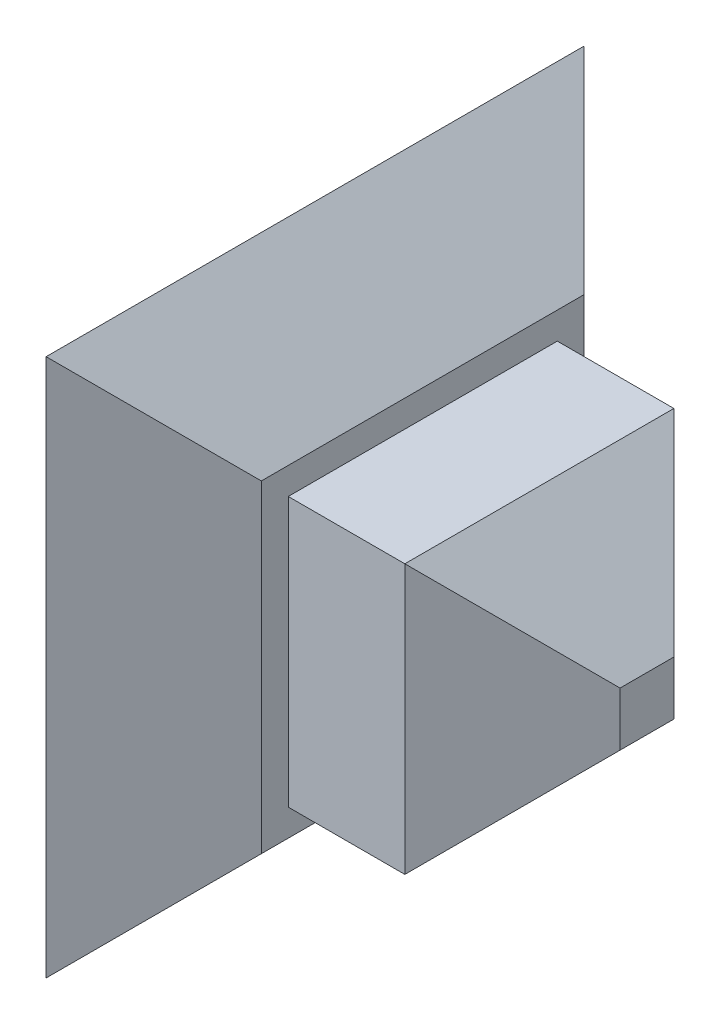
ISO-10303-21;
HEADER;
FILE_DESCRIPTION(('STEP AP214'),'2;1');
FILE_NAME('part.step','',(''),(''),'','','');
FILE_SCHEMA(('AUTOMOTIVE_DESIGN { 1 0 10303 214 1 1 1 1 }'));
ENDSEC;
DATA;
#1=APPLICATION_CONTEXT('core data for automotive mechanical design processes');
#2=APPLICATION_PROTOCOL_DEFINITION('international standard','automotive_design',2000,#1);
#3=PRODUCT_CONTEXT('',#1,'mechanical');
#4=PRODUCT('Part','Part','',(#3));
#5=PRODUCT_RELATED_PRODUCT_CATEGORY('part','',(#4));
#6=PRODUCT_DEFINITION_FORMATION('','',#4);
#7=PRODUCT_DEFINITION_CONTEXT('part definition',#1,'design');
#8=PRODUCT_DEFINITION('design','',#6,#7);
#9=PRODUCT_DEFINITION_SHAPE('','',#8);
#10=(LENGTH_UNIT() NAMED_UNIT(*) SI_UNIT(.MILLI.,.METRE.));
#11=(NAMED_UNIT(*) PLANE_ANGLE_UNIT() SI_UNIT($,.RADIAN.));
#12=(NAMED_UNIT(*) SI_UNIT($,.STERADIAN.) SOLID_ANGLE_UNIT());
#13=UNCERTAINTY_MEASURE_WITH_UNIT(LENGTH_MEASURE(1.E-05),#10,'distance_accuracy_value','');
#14=(GEOMETRIC_REPRESENTATION_CONTEXT(3) GLOBAL_UNCERTAINTY_ASSIGNED_CONTEXT((#13)) GLOBAL_UNIT_ASSIGNED_CONTEXT((#10,
#11,#12)) REPRESENTATION_CONTEXT('',''));
#15=CARTESIAN_POINT('',(0.,0.,0.));
#16=DIRECTION('',(0.,0.,1.));
#17=DIRECTION('',(1.,0.,0.));
#18=AXIS2_PLACEMENT_3D('',#15,#16,#17);
#19=CARTESIAN_POINT('',(-19.05,19.05,19.05));
#20=DIRECTION('',(0.,0.,1.));
#21=DIRECTION('',(0.,-1.,0.));
#22=AXIS2_PLACEMENT_3D('',#19,#20,#21);
#23=PLANE('',#22);
#24=DIRECTION('',(1.,0.,0.));
#25=VECTOR('',#24,1.);
#26=CARTESIAN_POINT('',(-19.05,19.05,19.05));
#27=LINE('',#26,#25);
#28=CARTESIAN_POINT('',(-16.51,19.05,19.05));
#29=VERTEX_POINT('',#28);
#30=CARTESIAN_POINT('',(0.,19.05,19.05));
#31=VERTEX_POINT('',#30);
#32=EDGE_CURVE('E55',#29,#31,#27,.T.);
#33=ORIENTED_EDGE('',*,*,#32,.F.);
#34=DIRECTION('',(0.,-1.,0.));
#35=VECTOR('',#34,1.);
#36=CARTESIAN_POINT('',(-16.51,19.05,19.05));
#37=LINE('',#36,#35);
#38=CARTESIAN_POINT('',(-16.51,-19.05,19.05));
#39=VERTEX_POINT('',#38);
#40=EDGE_CURVE('E184',#29,#39,#37,.T.);
#41=ORIENTED_EDGE('',*,*,#40,.T.);
#42=DIRECTION('',(1.,0.,0.));
#43=VECTOR('',#42,1.);
#44=CARTESIAN_POINT('',(-19.05,-19.05,19.05));
#45=LINE('',#44,#43);
#46=CARTESIAN_POINT('',(0.,-19.05,19.05));
#47=VERTEX_POINT('',#46);
#48=EDGE_CURVE('E233',#39,#47,#45,.T.);
#49=ORIENTED_EDGE('',*,*,#48,.T.);
#50=DIRECTION('',(0.,-1.,0.));
#51=VECTOR('',#50,1.);
#52=CARTESIAN_POINT('',(0.,19.05,19.05));
#53=LINE('',#52,#51);
#54=EDGE_CURVE('E193',#31,#47,#53,.T.);
#55=ORIENTED_EDGE('',*,*,#54,.F.);
#56=EDGE_LOOP('',(#33,#41,#49,#55));
#57=FACE_BOUND('',#56,.T.);
#58=ADVANCED_FACE('F47',(#57),#23,.T.);
#59=CARTESIAN_POINT('',(-19.05,19.05,-19.05));
#60=DIRECTION('',(0.,1.,0.));
#61=DIRECTION('',(0.,0.,1.));
#62=AXIS2_PLACEMENT_3D('',#59,#60,#61);
#63=PLANE('',#62);
#64=DIRECTION('',(1.,0.,0.));
#65=VECTOR('',#64,1.);
#66=CARTESIAN_POINT('',(-19.05,19.05,-19.05));
#67=LINE('',#66,#65);
#68=CARTESIAN_POINT('',(-16.51,19.05,-19.05));
#69=VERTEX_POINT('',#68);
#70=CARTESIAN_POINT('',(0.,19.05,-19.05));
#71=VERTEX_POINT('',#70);
#72=EDGE_CURVE('E68',#69,#71,#67,.T.);
#73=ORIENTED_EDGE('',*,*,#72,.F.);
#74=DIRECTION('',(0.,0.,1.));
#75=VECTOR('',#74,1.);
#76=CARTESIAN_POINT('',(-16.51,19.05,-19.05));
#77=LINE('',#76,#75);
#78=EDGE_CURVE('E180',#69,#29,#77,.T.);
#79=ORIENTED_EDGE('',*,*,#78,.T.);
#80=ORIENTED_EDGE('',*,*,#32,.T.);
#81=DIRECTION('',(0.,0.,1.));
#82=VECTOR('',#81,1.);
#83=CARTESIAN_POINT('',(0.,19.05,-19.05));
#84=LINE('',#83,#82);
#85=EDGE_CURVE('E229',#71,#31,#84,.T.);
#86=ORIENTED_EDGE('',*,*,#85,.F.);
#87=EDGE_LOOP('',(#73,#79,#80,#86));
#88=FACE_BOUND('',#87,.T.);
#89=ADVANCED_FACE('F262',(#88),#63,.T.);
#90=CARTESIAN_POINT('',(-19.05,19.05,-19.05));
#91=DIRECTION('',(0.,0.,-1.));
#92=DIRECTION('',(0.,1.,0.));
#93=AXIS2_PLACEMENT_3D('',#90,#91,#92);
#94=PLANE('',#93);
#95=DIRECTION('',(1.,0.,0.));
#96=VECTOR('',#95,1.);
#97=CARTESIAN_POINT('',(-19.05,-19.05,-19.05));
#98=LINE('',#97,#96);
#99=CARTESIAN_POINT('',(-16.51,-19.05,-19.05));
#100=VERTEX_POINT('',#99);
#101=CARTESIAN_POINT('',(0.,-19.05,-19.05));
#102=VERTEX_POINT('',#101);
#103=EDGE_CURVE('E238',#100,#102,#98,.T.);
#104=ORIENTED_EDGE('',*,*,#103,.F.);
#105=DIRECTION('',(0.,1.,0.));
#106=VECTOR('',#105,1.);
#107=CARTESIAN_POINT('',(-16.51,19.05,-19.05));
#108=LINE('',#107,#106);
#109=EDGE_CURVE('E62',#100,#69,#108,.T.);
#110=ORIENTED_EDGE('',*,*,#109,.T.);
#111=ORIENTED_EDGE('',*,*,#72,.T.);
#112=DIRECTION('',(0.,1.,0.));
#113=VECTOR('',#112,1.);
#114=CARTESIAN_POINT('',(0.,19.05,-19.05));
#115=LINE('',#114,#113);
#116=EDGE_CURVE('E225',#102,#71,#115,.T.);
#117=ORIENTED_EDGE('',*,*,#116,.F.);
#118=EDGE_LOOP('',(#104,#110,#111,#117));
#119=FACE_BOUND('',#118,.T.);
#120=ADVANCED_FACE('F266',(#119),#94,.T.);
#121=CARTESIAN_POINT('',(-19.05,-19.05,-19.05));
#122=DIRECTION('',(0.,-1.,0.));
#123=DIRECTION('',(0.,0.,-1.));
#124=AXIS2_PLACEMENT_3D('',#121,#122,#123);
#125=PLANE('',#124);
#126=ORIENTED_EDGE('',*,*,#48,.F.);
#127=DIRECTION('',(0.,0.,-1.));
#128=VECTOR('',#127,1.);
#129=CARTESIAN_POINT('',(-16.51,-19.05,-19.05));
#130=LINE('',#129,#128);
#131=EDGE_CURVE('E11',#39,#100,#130,.T.);
#132=ORIENTED_EDGE('',*,*,#131,.T.);
#133=ORIENTED_EDGE('',*,*,#103,.T.);
#134=DIRECTION('',(0.,0.,-1.));
#135=VECTOR('',#134,1.);
#136=CARTESIAN_POINT('',(0.,-19.05,-19.05));
#137=LINE('',#136,#135);
#138=EDGE_CURVE('E221',#47,#102,#137,.T.);
#139=ORIENTED_EDGE('',*,*,#138,.F.);
#140=EDGE_LOOP('',(#126,#132,#133,#139));
#141=FACE_BOUND('',#140,.T.);
#142=ADVANCED_FACE('F247',(#141),#125,.T.);
#143=CARTESIAN_POINT('',(0.,19.05,19.05));
#144=DIRECTION('',(0.707106781186549,0.,0.707106781186546));
#145=DIRECTION('',(0.707106781186546,0.,-0.707106781186549));
#146=AXIS2_PLACEMENT_3D('',#143,#144,#145);
#147=PLANE('',#146);
#148=ORIENTED_EDGE('',*,*,#54,.T.);
#149=DIRECTION('',(-0.577350269189624,-0.577350269189627,0.577350269189626));
#150=VECTOR('',#149,1.);
#151=CARTESIAN_POINT('',(12.7,-6.34999999999997,6.34999999999997));
#152=LINE('',#151,#150);
#153=CARTESIAN_POINT('',(15.24,-3.80999999999995,3.80999999999995));
#154=VERTEX_POINT('',#153);
#155=EDGE_CURVE('E189',#154,#47,#152,.T.);
#156=ORIENTED_EDGE('',*,*,#155,.F.);
#157=DIRECTION('',(0.,1.,0.));
#158=VECTOR('',#157,1.);
#159=CARTESIAN_POINT('',(15.24,0.,3.80999999999995));
#160=LINE('',#159,#158);
#161=CARTESIAN_POINT('',(15.24,3.80999999999995,3.80999999999995));
#162=VERTEX_POINT('',#161);
#163=EDGE_CURVE('E188',#162,#154,#160,.F.);
#164=ORIENTED_EDGE('',*,*,#163,.F.);
#165=DIRECTION('',(-0.577350269189624,0.577350269189626,0.577350269189627));
#166=VECTOR('',#165,1.);
#167=CARTESIAN_POINT('',(0.,19.05,19.05));
#168=LINE('',#167,#166);
#169=EDGE_CURVE('E195',#162,#31,#168,.T.);
#170=ORIENTED_EDGE('',*,*,#169,.T.);
#171=EDGE_LOOP('',(#148,#156,#164,#170));
#172=FACE_BOUND('',#171,.T.);
#173=ADVANCED_FACE('F255',(#172),#147,.T.);
#174=CARTESIAN_POINT('',(0.,-19.05,-19.05));
#175=DIRECTION('',(0.707106781186549,-0.707106781186546,0.));
#176=DIRECTION('',(0.707106781186546,0.707106781186549,0.));
#177=AXIS2_PLACEMENT_3D('',#174,#175,#176);
#178=PLANE('',#177);
#179=ORIENTED_EDGE('',*,*,#138,.T.);
#180=DIRECTION('',(-0.577350269189624,-0.577350269189626,-0.577350269189627));
#181=VECTOR('',#180,1.);
#182=CARTESIAN_POINT('',(12.7,-6.34999999999997,-6.34999999999997));
#183=LINE('',#182,#181);
#184=CARTESIAN_POINT('',(15.24,-3.80999999999995,-3.80999999999995));
#185=VERTEX_POINT('',#184);
#186=EDGE_CURVE('E194',#185,#102,#183,.T.);
#187=ORIENTED_EDGE('',*,*,#186,.F.);
#188=DIRECTION('',(0.,0.,1.));
#189=VECTOR('',#188,1.);
#190=CARTESIAN_POINT('',(15.24,-3.80999999999995,0.));
#191=LINE('',#190,#189);
#192=EDGE_CURVE('E210',#154,#185,#191,.F.);
#193=ORIENTED_EDGE('',*,*,#192,.F.);
#194=ORIENTED_EDGE('',*,*,#155,.T.);
#195=EDGE_LOOP('',(#179,#187,#193,#194));
#196=FACE_BOUND('',#195,.T.);
#197=ADVANCED_FACE('F252',(#196),#178,.T.);
#198=CARTESIAN_POINT('',(0.,19.05,-19.05));
#199=DIRECTION('',(0.707106781186549,0.,-0.707106781186546));
#200=DIRECTION('',(-0.707106781186546,0.,-0.707106781186549));
#201=AXIS2_PLACEMENT_3D('',#198,#199,#200);
#202=PLANE('',#201);
#203=ORIENTED_EDGE('',*,*,#116,.T.);
#204=DIRECTION('',(-0.577350269189624,0.577350269189627,-0.577350269189626));
#205=VECTOR('',#204,1.);
#206=CARTESIAN_POINT('',(0.,19.05,-19.05));
#207=LINE('',#206,#205);
#208=CARTESIAN_POINT('',(15.24,3.80999999999995,-3.80999999999995));
#209=VERTEX_POINT('',#208);
#210=EDGE_CURVE('E199',#209,#71,#207,.T.);
#211=ORIENTED_EDGE('',*,*,#210,.F.);
#212=DIRECTION('',(0.,-1.,0.));
#213=VECTOR('',#212,1.);
#214=CARTESIAN_POINT('',(15.24,0.,-3.80999999999995));
#215=LINE('',#214,#213);
#216=EDGE_CURVE('E213',#185,#209,#215,.F.);
#217=ORIENTED_EDGE('',*,*,#216,.F.);
#218=ORIENTED_EDGE('',*,*,#186,.T.);
#219=EDGE_LOOP('',(#203,#211,#217,#218));
#220=FACE_BOUND('',#219,.T.);
#221=ADVANCED_FACE('F264',(#220),#202,.T.);
#222=CARTESIAN_POINT('',(0.,19.05,-19.05));
#223=DIRECTION('',(0.707106781186549,0.707106781186546,0.));
#224=DIRECTION('',(-0.707106781186546,0.707106781186549,0.));
#225=AXIS2_PLACEMENT_3D('',#222,#223,#224);
#226=PLANE('',#225);
#227=ORIENTED_EDGE('',*,*,#85,.T.);
#228=ORIENTED_EDGE('',*,*,#169,.F.);
#229=DIRECTION('',(0.,0.,-1.));
#230=VECTOR('',#229,1.);
#231=CARTESIAN_POINT('',(15.24,3.80999999999995,0.));
#232=LINE('',#231,#230);
#233=EDGE_CURVE('E200',#209,#162,#232,.F.);
#234=ORIENTED_EDGE('',*,*,#233,.F.);
#235=ORIENTED_EDGE('',*,*,#210,.T.);
#236=EDGE_LOOP('',(#227,#228,#234,#235));
#237=FACE_BOUND('',#236,.T.);
#238=ADVANCED_FACE('F259',(#237),#226,.T.);
#239=CARTESIAN_POINT('',(15.24,0.,0.));
#240=DIRECTION('',(-1.,0.,0.));
#241=DIRECTION('',(0.,0.,1.));
#242=AXIS2_PLACEMENT_3D('',#239,#240,#241);
#243=PLANE('',#242);
#244=ORIENTED_EDGE('',*,*,#163,.T.);
#245=ORIENTED_EDGE('',*,*,#192,.T.);
#246=ORIENTED_EDGE('',*,*,#216,.T.);
#247=ORIENTED_EDGE('',*,*,#233,.T.);
#248=EDGE_LOOP('',(#244,#245,#246,#247));
#249=FACE_BOUND('',#248,.T.);
#250=ADVANCED_FACE('F282',(#249),#243,.F.);
#251=CARTESIAN_POINT('',(-19.05,25.4,25.4));
#252=DIRECTION('',(0.707106781186549,0.,0.707106781186546));
#253=DIRECTION('',(0.707106781186546,0.,-0.707106781186549));
#254=AXIS2_PLACEMENT_3D('',#251,#252,#253);
#255=PLANE('',#254);
#256=DIRECTION('',(-0.577350269189624,0.577350269189627,0.577350269189626));
#257=VECTOR('',#256,1.);
#258=CARTESIAN_POINT('',(-19.05,25.4,25.4));
#259=LINE('',#258,#257);
#260=CARTESIAN_POINT('',(-16.51,22.86,22.86));
#261=VERTEX_POINT('',#260);
#262=CARTESIAN_POINT('',(-31.75,38.1,38.1));
#263=VERTEX_POINT('',#262);
#264=EDGE_CURVE('E124',#261,#263,#259,.T.);
#265=ORIENTED_EDGE('',*,*,#264,.T.);
#266=DIRECTION('',(0.,-1.,0.));
#267=VECTOR('',#266,1.);
#268=CARTESIAN_POINT('',(-31.75,25.4,38.1));
#269=LINE('',#268,#267);
#270=CARTESIAN_POINT('',(-31.75,-38.1000000000001,38.1000000000001));
#271=VERTEX_POINT('',#270);
#272=EDGE_CURVE('E128',#271,#263,#269,.F.);
#273=ORIENTED_EDGE('',*,*,#272,.F.);
#274=DIRECTION('',(-0.577350269189624,-0.577350269189627,0.577350269189627));
#275=VECTOR('',#274,1.);
#276=CARTESIAN_POINT('',(-2.11666666666668,-8.46666666666663,8.46666666666663));
#277=LINE('',#276,#275);
#278=CARTESIAN_POINT('',(-16.51,-22.86,22.86));
#279=VERTEX_POINT('',#278);
#280=EDGE_CURVE('E158',#279,#271,#277,.T.);
#281=ORIENTED_EDGE('',*,*,#280,.F.);
#282=DIRECTION('',(0.,1.,0.));
#283=VECTOR('',#282,1.);
#284=CARTESIAN_POINT('',(-16.51,0.,22.86));
#285=LINE('',#284,#283);
#286=EDGE_CURVE('E130',#279,#261,#285,.T.);
#287=ORIENTED_EDGE('',*,*,#286,.T.);
#288=EDGE_LOOP('',(#265,#273,#281,#287));
#289=FACE_BOUND('',#288,.T.);
#290=ADVANCED_FACE('F126',(#289),#255,.T.);
#291=CARTESIAN_POINT('',(-19.05,-25.4,-25.4));
#292=DIRECTION('',(0.707106781186549,-0.707106781186546,0.));
#293=DIRECTION('',(0.707106781186546,0.707106781186549,0.));
#294=AXIS2_PLACEMENT_3D('',#291,#292,#293);
#295=PLANE('',#294);
#296=ORIENTED_EDGE('',*,*,#280,.T.);
#297=DIRECTION('',(0.,0.,-1.));
#298=VECTOR('',#297,1.);
#299=CARTESIAN_POINT('',(-31.75,-38.1000000000001,-25.4));
#300=LINE('',#299,#298);
#301=CARTESIAN_POINT('',(-31.75,-38.1000000000001,-38.1));
#302=VERTEX_POINT('',#301);
#303=EDGE_CURVE('E150',#302,#271,#300,.F.);
#304=ORIENTED_EDGE('',*,*,#303,.F.);
#305=DIRECTION('',(-0.577350269189624,-0.577350269189626,-0.577350269189627));
#306=VECTOR('',#305,1.);
#307=CARTESIAN_POINT('',(-2.11666666666669,-8.46666666666664,-8.46666666666663));
#308=LINE('',#307,#306);
#309=CARTESIAN_POINT('',(-16.51,-22.86,-22.86));
#310=VERTEX_POINT('',#309);
#311=EDGE_CURVE('E160',#310,#302,#308,.T.);
#312=ORIENTED_EDGE('',*,*,#311,.F.);
#313=DIRECTION('',(0.,0.,1.));
#314=VECTOR('',#313,1.);
#315=CARTESIAN_POINT('',(-16.51,-22.86,0.));
#316=LINE('',#315,#314);
#317=EDGE_CURVE('E136',#310,#279,#316,.T.);
#318=ORIENTED_EDGE('',*,*,#317,.T.);
#319=EDGE_LOOP('',(#296,#304,#312,#318));
#320=FACE_BOUND('',#319,.T.);
#321=ADVANCED_FACE('F340',(#320),#295,.T.);
#322=CARTESIAN_POINT('',(-19.05,25.4,-25.4));
#323=DIRECTION('',(0.707106781186549,0.,-0.707106781186546));
#324=DIRECTION('',(-0.707106781186546,0.,-0.707106781186549));
#325=AXIS2_PLACEMENT_3D('',#322,#323,#324);
#326=PLANE('',#325);
#327=ORIENTED_EDGE('',*,*,#311,.T.);
#328=DIRECTION('',(0.,1.,0.));
#329=VECTOR('',#328,1.);
#330=CARTESIAN_POINT('',(-31.75,25.4,-38.1));
#331=LINE('',#330,#329);
#332=CARTESIAN_POINT('',(-31.75,38.1,-38.1));
#333=VERTEX_POINT('',#332);
#334=EDGE_CURVE('E145',#333,#302,#331,.F.);
#335=ORIENTED_EDGE('',*,*,#334,.F.);
#336=DIRECTION('',(-0.577350269189624,0.577350269189627,-0.577350269189627));
#337=VECTOR('',#336,1.);
#338=CARTESIAN_POINT('',(-19.05,25.4,-25.4));
#339=LINE('',#338,#337);
#340=CARTESIAN_POINT('',(-16.51,22.86,-22.86));
#341=VERTEX_POINT('',#340);
#342=EDGE_CURVE('E135',#341,#333,#339,.T.);
#343=ORIENTED_EDGE('',*,*,#342,.F.);
#344=DIRECTION('',(0.,-1.,0.));
#345=VECTOR('',#344,1.);
#346=CARTESIAN_POINT('',(-16.51,0.,-22.86));
#347=LINE('',#346,#345);
#348=EDGE_CURVE('E172',#341,#310,#347,.T.);
#349=ORIENTED_EDGE('',*,*,#348,.T.);
#350=EDGE_LOOP('',(#327,#335,#343,#349));
#351=FACE_BOUND('',#350,.T.);
#352=ADVANCED_FACE('F343',(#351),#326,.T.);
#353=CARTESIAN_POINT('',(-19.05,25.4,-25.4));
#354=DIRECTION('',(0.707106781186549,0.707106781186546,0.));
#355=DIRECTION('',(-0.707106781186546,0.707106781186549,0.));
#356=AXIS2_PLACEMENT_3D('',#353,#354,#355);
#357=PLANE('',#356);
#358=ORIENTED_EDGE('',*,*,#342,.T.);
#359=DIRECTION('',(0.,0.,1.));
#360=VECTOR('',#359,1.);
#361=CARTESIAN_POINT('',(-31.75,38.1,-25.4));
#362=LINE('',#361,#360);
#363=EDGE_CURVE('E139',#263,#333,#362,.F.);
#364=ORIENTED_EDGE('',*,*,#363,.F.);
#365=ORIENTED_EDGE('',*,*,#264,.F.);
#366=DIRECTION('',(0.,0.,-1.));
#367=VECTOR('',#366,1.);
#368=CARTESIAN_POINT('',(-16.51,22.86,0.));
#369=LINE('',#368,#367);
#370=EDGE_CURVE('E168',#261,#341,#369,.T.);
#371=ORIENTED_EDGE('',*,*,#370,.T.);
#372=EDGE_LOOP('',(#358,#364,#365,#371));
#373=FACE_BOUND('',#372,.T.);
#374=ADVANCED_FACE('F140',(#373),#357,.T.);
#375=CARTESIAN_POINT('',(-16.51,0.,0.));
#376=DIRECTION('',(-1.,0.,0.));
#377=DIRECTION('',(0.,0.,1.));
#378=AXIS2_PLACEMENT_3D('',#375,#376,#377);
#379=PLANE('',#378);
#380=ORIENTED_EDGE('',*,*,#40,.F.);
#381=ORIENTED_EDGE('',*,*,#78,.F.);
#382=ORIENTED_EDGE('',*,*,#109,.F.);
#383=ORIENTED_EDGE('',*,*,#131,.F.);
#384=EDGE_LOOP('',(#380,#381,#382,#383));
#385=FACE_BOUND('',#384,.T.);
#386=ORIENTED_EDGE('',*,*,#286,.F.);
#387=ORIENTED_EDGE('',*,*,#317,.F.);
#388=ORIENTED_EDGE('',*,*,#348,.F.);
#389=ORIENTED_EDGE('',*,*,#370,.F.);
#390=EDGE_LOOP('',(#386,#387,#388,#389));
#391=FACE_BOUND('',#390,.T.);
#392=ADVANCED_FACE('F350',(#385,#391),#379,.F.);
#393=CARTESIAN_POINT('',(-31.75,0.,0.));
#394=DIRECTION('',(-1.,0.,0.));
#395=DIRECTION('',(0.,0.,1.));
#396=AXIS2_PLACEMENT_3D('',#393,#394,#395);
#397=PLANE('',#396);
#398=ORIENTED_EDGE('',*,*,#272,.T.);
#399=ORIENTED_EDGE('',*,*,#363,.T.);
#400=ORIENTED_EDGE('',*,*,#334,.T.);
#401=ORIENTED_EDGE('',*,*,#303,.T.);
#402=EDGE_LOOP('',(#398,#399,#400,#401));
#403=FACE_BOUND('',#402,.T.);
#404=ADVANCED_FACE('F148',(#403),#397,.T.);
#405=CLOSED_SHELL('',(#58,#89,#120,#142,#173,#197,#221,#238,#250,#290,#321,#352,#374,#392,#404));
#406=MANIFOLD_SOLID_BREP('B2',#405);
#407=ADVANCED_BREP_SHAPE_REPRESENTATION('',(#18,#406),#14);
#408=SHAPE_DEFINITION_REPRESENTATION(#9,#407);
ENDSEC;
END-ISO-10303-21;
